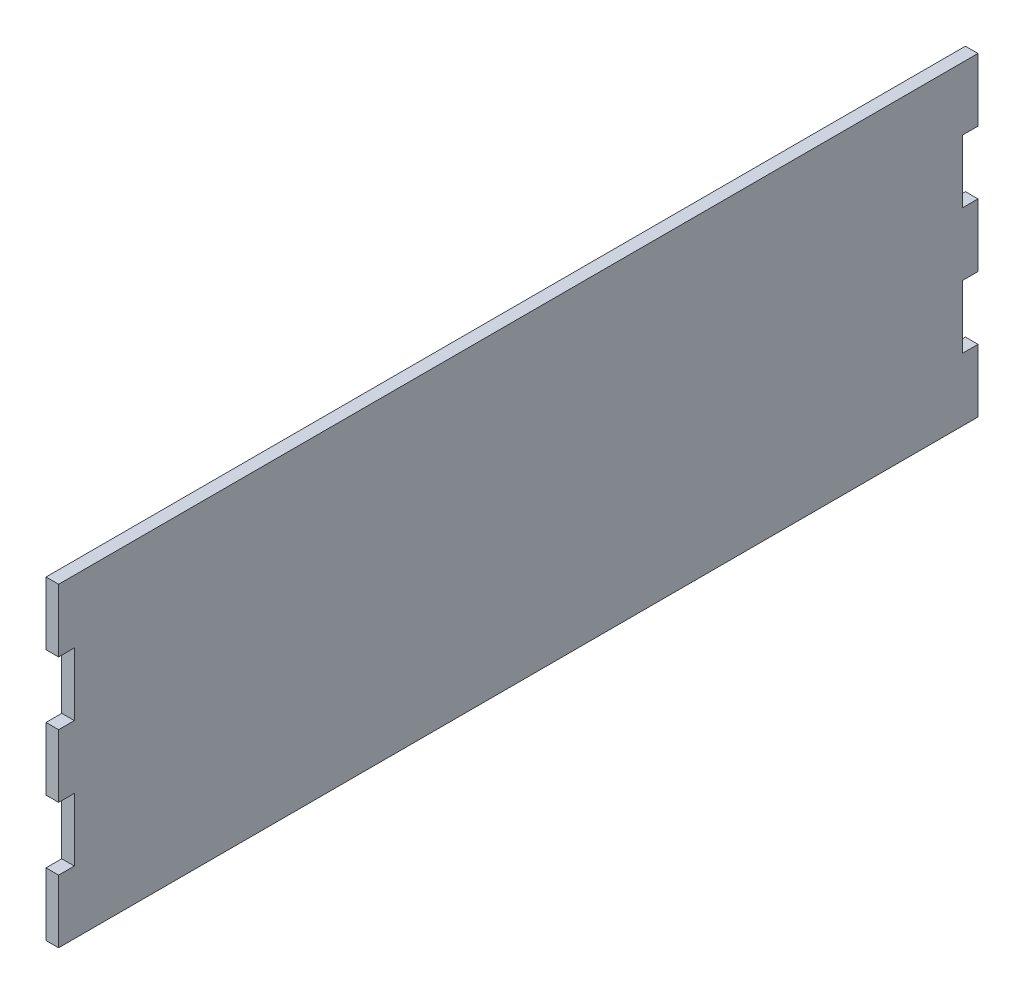
ISO-10303-21;
HEADER;
FILE_DESCRIPTION(('STEP AP214'),'2;1');
FILE_NAME('part.step','',(''),(''),'','','');
FILE_SCHEMA(('AUTOMOTIVE_DESIGN { 1 0 10303 214 1 1 1 1 }'));
ENDSEC;
DATA;
#1=APPLICATION_CONTEXT('core data for automotive mechanical design processes');
#2=APPLICATION_PROTOCOL_DEFINITION('international standard','automotive_design',2000,#1);
#3=PRODUCT_CONTEXT('',#1,'mechanical');
#4=PRODUCT('Part','Part','',(#3));
#5=PRODUCT_RELATED_PRODUCT_CATEGORY('part','',(#4));
#6=PRODUCT_DEFINITION_FORMATION('','',#4);
#7=PRODUCT_DEFINITION_CONTEXT('part definition',#1,'design');
#8=PRODUCT_DEFINITION('design','',#6,#7);
#9=PRODUCT_DEFINITION_SHAPE('','',#8);
#10=(LENGTH_UNIT() NAMED_UNIT(*) SI_UNIT(.MILLI.,.METRE.));
#11=(NAMED_UNIT(*) PLANE_ANGLE_UNIT() SI_UNIT($,.RADIAN.));
#12=(NAMED_UNIT(*) SI_UNIT($,.STERADIAN.) SOLID_ANGLE_UNIT());
#13=UNCERTAINTY_MEASURE_WITH_UNIT(LENGTH_MEASURE(1.E-05),#10,'distance_accuracy_value','');
#14=(GEOMETRIC_REPRESENTATION_CONTEXT(3) GLOBAL_UNCERTAINTY_ASSIGNED_CONTEXT((#13)) GLOBAL_UNIT_ASSIGNED_CONTEXT((#10,
#11,#12)) REPRESENTATION_CONTEXT('',''));
#15=CARTESIAN_POINT('',(0.,0.,0.));
#16=DIRECTION('',(0.,0.,1.));
#17=DIRECTION('',(1.,0.,0.));
#18=AXIS2_PLACEMENT_3D('',#15,#16,#17);
#19=CARTESIAN_POINT('',(4.,-32.0380290037037,-145.));
#20=DIRECTION('',(0.,0.,1.));
#21=DIRECTION('',(0.,-1.,0.));
#22=AXIS2_PLACEMENT_3D('',#19,#20,#21);
#23=PLANE('',#22);
#24=DIRECTION('',(0.,1.,0.));
#25=VECTOR('',#24,1.);
#26=CARTESIAN_POINT('',(0.,-32.0380290037037,-145.));
#27=LINE('',#26,#25);
#28=CARTESIAN_POINT('',(0.,-52.0380290037037,-145.));
#29=VERTEX_POINT('',#28);
#30=CARTESIAN_POINT('',(0.,-32.0380290037037,-145.));
#31=VERTEX_POINT('',#30);
#32=EDGE_CURVE('E205',#29,#31,#27,.T.);
#33=ORIENTED_EDGE('',*,*,#32,.T.);
#34=DIRECTION('',(-1.,0.,0.));
#35=VECTOR('',#34,1.);
#36=CARTESIAN_POINT('',(4.,-32.0380290037037,-145.));
#37=LINE('',#36,#35);
#38=CARTESIAN_POINT('',(4.,-32.0380290037037,-145.));
#39=VERTEX_POINT('',#38);
#40=EDGE_CURVE('E11',#39,#31,#37,.T.);
#41=ORIENTED_EDGE('',*,*,#40,.F.);
#42=DIRECTION('',(0.,1.,0.));
#43=VECTOR('',#42,1.);
#44=CARTESIAN_POINT('',(4.,-32.0380290037037,-145.));
#45=LINE('',#44,#43);
#46=CARTESIAN_POINT('',(4.,-52.0380290037037,-145.));
#47=VERTEX_POINT('',#46);
#48=EDGE_CURVE('E243',#47,#39,#45,.T.);
#49=ORIENTED_EDGE('',*,*,#48,.F.);
#50=DIRECTION('',(-1.,0.,0.));
#51=VECTOR('',#50,1.);
#52=CARTESIAN_POINT('',(4.,-52.0380290037037,-145.));
#53=LINE('',#52,#51);
#54=EDGE_CURVE('E201',#47,#29,#53,.T.);
#55=ORIENTED_EDGE('',*,*,#54,.T.);
#56=EDGE_LOOP('',(#33,#41,#49,#55));
#57=FACE_BOUND('',#56,.T.);
#58=ADVANCED_FACE('F37',(#57),#23,.F.);
#59=CARTESIAN_POINT('',(4.,-32.0380290037037,-145.));
#60=DIRECTION('',(0.,-1.,0.));
#61=DIRECTION('',(0.,0.,-1.));
#62=AXIS2_PLACEMENT_3D('',#59,#60,#61);
#63=PLANE('',#62);
#64=DIRECTION('',(0.,0.,1.));
#65=VECTOR('',#64,1.);
#66=CARTESIAN_POINT('',(0.,-32.0380290037037,-145.));
#67=LINE('',#66,#65);
#68=CARTESIAN_POINT('',(0.,-32.0380290037037,-140.));
#69=VERTEX_POINT('',#68);
#70=EDGE_CURVE('E208',#31,#69,#67,.T.);
#71=ORIENTED_EDGE('',*,*,#70,.T.);
#72=DIRECTION('',(-1.,0.,0.));
#73=VECTOR('',#72,1.);
#74=CARTESIAN_POINT('',(4.,-32.0380290037037,-140.));
#75=LINE('',#74,#73);
#76=CARTESIAN_POINT('',(4.,-32.0380290037037,-140.));
#77=VERTEX_POINT('',#76);
#78=EDGE_CURVE('E45',#77,#69,#75,.T.);
#79=ORIENTED_EDGE('',*,*,#78,.F.);
#80=DIRECTION('',(0.,0.,1.));
#81=VECTOR('',#80,1.);
#82=CARTESIAN_POINT('',(4.,-32.0380290037037,-145.));
#83=LINE('',#82,#81);
#84=EDGE_CURVE('E132',#39,#77,#83,.T.);
#85=ORIENTED_EDGE('',*,*,#84,.F.);
#86=ORIENTED_EDGE('',*,*,#40,.T.);
#87=EDGE_LOOP('',(#71,#79,#85,#86));
#88=FACE_BOUND('',#87,.T.);
#89=ADVANCED_FACE('F361',(#88),#63,.F.);
#90=CARTESIAN_POINT('',(4.,-12.0380290037037,-140.));
#91=DIRECTION('',(0.,0.,1.));
#92=DIRECTION('',(0.,-1.,0.));
#93=AXIS2_PLACEMENT_3D('',#90,#91,#92);
#94=PLANE('',#93);
#95=DIRECTION('',(0.,1.,0.));
#96=VECTOR('',#95,1.);
#97=CARTESIAN_POINT('',(0.,-12.0380290037037,-140.));
#98=LINE('',#97,#96);
#99=CARTESIAN_POINT('',(0.,-12.0380290037037,-140.));
#100=VERTEX_POINT('',#99);
#101=EDGE_CURVE('E210',#69,#100,#98,.T.);
#102=ORIENTED_EDGE('',*,*,#101,.T.);
#103=DIRECTION('',(-1.,0.,0.));
#104=VECTOR('',#103,1.);
#105=CARTESIAN_POINT('',(4.,-12.0380290037037,-140.));
#106=LINE('',#105,#104);
#107=CARTESIAN_POINT('',(4.,-12.0380290037037,-140.));
#108=VERTEX_POINT('',#107);
#109=EDGE_CURVE('E286',#108,#100,#106,.T.);
#110=ORIENTED_EDGE('',*,*,#109,.F.);
#111=DIRECTION('',(0.,1.,0.));
#112=VECTOR('',#111,1.);
#113=CARTESIAN_POINT('',(4.,-12.0380290037037,-140.));
#114=LINE('',#113,#112);
#115=EDGE_CURVE('E294',#77,#108,#114,.T.);
#116=ORIENTED_EDGE('',*,*,#115,.F.);
#117=ORIENTED_EDGE('',*,*,#78,.T.);
#118=EDGE_LOOP('',(#102,#110,#116,#117));
#119=FACE_BOUND('',#118,.T.);
#120=ADVANCED_FACE('F292',(#119),#94,.F.);
#121=CARTESIAN_POINT('',(4.,-12.0380290037037,-145.));
#122=DIRECTION('',(0.,1.,0.));
#123=DIRECTION('',(0.,0.,1.));
#124=AXIS2_PLACEMENT_3D('',#121,#122,#123);
#125=PLANE('',#124);
#126=DIRECTION('',(0.,0.,-1.));
#127=VECTOR('',#126,1.);
#128=CARTESIAN_POINT('',(0.,-12.0380290037037,-145.));
#129=LINE('',#128,#127);
#130=CARTESIAN_POINT('',(0.,-12.0380290037037,-145.));
#131=VERTEX_POINT('',#130);
#132=EDGE_CURVE('E212',#100,#131,#129,.T.);
#133=ORIENTED_EDGE('',*,*,#132,.T.);
#134=DIRECTION('',(-1.,0.,0.));
#135=VECTOR('',#134,1.);
#136=CARTESIAN_POINT('',(4.,-12.0380290037037,-145.));
#137=LINE('',#136,#135);
#138=CARTESIAN_POINT('',(4.,-12.0380290037037,-145.));
#139=VERTEX_POINT('',#138);
#140=EDGE_CURVE('E283',#139,#131,#137,.T.);
#141=ORIENTED_EDGE('',*,*,#140,.F.);
#142=DIRECTION('',(0.,0.,-1.));
#143=VECTOR('',#142,1.);
#144=CARTESIAN_POINT('',(4.,-12.0380290037037,-145.));
#145=LINE('',#144,#143);
#146=EDGE_CURVE('E312',#108,#139,#145,.T.);
#147=ORIENTED_EDGE('',*,*,#146,.F.);
#148=ORIENTED_EDGE('',*,*,#109,.T.);
#149=EDGE_LOOP('',(#133,#141,#147,#148));
#150=FACE_BOUND('',#149,.T.);
#151=ADVANCED_FACE('F303',(#150),#125,.F.);
#152=CARTESIAN_POINT('',(4.,7.96197099629627,-145.));
#153=DIRECTION('',(0.,0.,1.));
#154=DIRECTION('',(0.,-1.,0.));
#155=AXIS2_PLACEMENT_3D('',#152,#153,#154);
#156=PLANE('',#155);
#157=DIRECTION('',(0.,1.,0.));
#158=VECTOR('',#157,1.);
#159=CARTESIAN_POINT('',(0.,7.96197099629627,-145.));
#160=LINE('',#159,#158);
#161=CARTESIAN_POINT('',(0.,7.96197099629627,-145.));
#162=VERTEX_POINT('',#161);
#163=EDGE_CURVE('E214',#131,#162,#160,.T.);
#164=ORIENTED_EDGE('',*,*,#163,.T.);
#165=DIRECTION('',(-1.,0.,0.));
#166=VECTOR('',#165,1.);
#167=CARTESIAN_POINT('',(4.,7.96197099629627,-145.));
#168=LINE('',#167,#166);
#169=CARTESIAN_POINT('',(4.,7.96197099629627,-145.));
#170=VERTEX_POINT('',#169);
#171=EDGE_CURVE('E280',#170,#162,#168,.T.);
#172=ORIENTED_EDGE('',*,*,#171,.F.);
#173=DIRECTION('',(0.,1.,0.));
#174=VECTOR('',#173,1.);
#175=CARTESIAN_POINT('',(4.,7.96197099629627,-145.));
#176=LINE('',#175,#174);
#177=EDGE_CURVE('E309',#139,#170,#176,.T.);
#178=ORIENTED_EDGE('',*,*,#177,.F.);
#179=ORIENTED_EDGE('',*,*,#140,.T.);
#180=EDGE_LOOP('',(#164,#172,#178,#179));
#181=FACE_BOUND('',#180,.T.);
#182=ADVANCED_FACE('F307',(#181),#156,.F.);
#183=CARTESIAN_POINT('',(4.,7.96197099629627,-145.));
#184=DIRECTION('',(0.,-1.,0.));
#185=DIRECTION('',(0.,0.,-1.));
#186=AXIS2_PLACEMENT_3D('',#183,#184,#185);
#187=PLANE('',#186);
#188=DIRECTION('',(0.,0.,1.));
#189=VECTOR('',#188,1.);
#190=CARTESIAN_POINT('',(0.,7.96197099629627,-145.));
#191=LINE('',#190,#189);
#192=CARTESIAN_POINT('',(0.,7.96197099629627,-140.));
#193=VERTEX_POINT('',#192);
#194=EDGE_CURVE('E216',#162,#193,#191,.T.);
#195=ORIENTED_EDGE('',*,*,#194,.T.);
#196=DIRECTION('',(-1.,0.,0.));
#197=VECTOR('',#196,1.);
#198=CARTESIAN_POINT('',(4.,7.96197099629627,-140.));
#199=LINE('',#198,#197);
#200=CARTESIAN_POINT('',(4.,7.96197099629627,-140.));
#201=VERTEX_POINT('',#200);
#202=EDGE_CURVE('E277',#201,#193,#199,.T.);
#203=ORIENTED_EDGE('',*,*,#202,.F.);
#204=DIRECTION('',(0.,0.,1.));
#205=VECTOR('',#204,1.);
#206=CARTESIAN_POINT('',(4.,7.96197099629627,-145.));
#207=LINE('',#206,#205);
#208=EDGE_CURVE('E311',#170,#201,#207,.T.);
#209=ORIENTED_EDGE('',*,*,#208,.F.);
#210=ORIENTED_EDGE('',*,*,#171,.T.);
#211=EDGE_LOOP('',(#195,#203,#209,#210));
#212=FACE_BOUND('',#211,.T.);
#213=ADVANCED_FACE('F374',(#212),#187,.F.);
#214=CARTESIAN_POINT('',(4.,27.9619709962963,-140.));
#215=DIRECTION('',(0.,0.,1.));
#216=DIRECTION('',(0.,-1.,0.));
#217=AXIS2_PLACEMENT_3D('',#214,#215,#216);
#218=PLANE('',#217);
#219=DIRECTION('',(0.,1.,0.));
#220=VECTOR('',#219,1.);
#221=CARTESIAN_POINT('',(0.,27.9619709962963,-140.));
#222=LINE('',#221,#220);
#223=CARTESIAN_POINT('',(0.,27.9619709962963,-140.));
#224=VERTEX_POINT('',#223);
#225=EDGE_CURVE('E218',#193,#224,#222,.T.);
#226=ORIENTED_EDGE('',*,*,#225,.T.);
#227=DIRECTION('',(-1.,0.,0.));
#228=VECTOR('',#227,1.);
#229=CARTESIAN_POINT('',(4.,27.9619709962963,-140.));
#230=LINE('',#229,#228);
#231=CARTESIAN_POINT('',(4.,27.9619709962963,-140.));
#232=VERTEX_POINT('',#231);
#233=EDGE_CURVE('E274',#232,#224,#230,.T.);
#234=ORIENTED_EDGE('',*,*,#233,.F.);
#235=DIRECTION('',(0.,1.,0.));
#236=VECTOR('',#235,1.);
#237=CARTESIAN_POINT('',(4.,27.9619709962963,-140.));
#238=LINE('',#237,#236);
#239=EDGE_CURVE('E314',#201,#232,#238,.T.);
#240=ORIENTED_EDGE('',*,*,#239,.F.);
#241=ORIENTED_EDGE('',*,*,#202,.T.);
#242=EDGE_LOOP('',(#226,#234,#240,#241));
#243=FACE_BOUND('',#242,.T.);
#244=ADVANCED_FACE('F377',(#243),#218,.F.);
#245=CARTESIAN_POINT('',(4.,27.9619709962963,-145.));
#246=DIRECTION('',(0.,1.,0.));
#247=DIRECTION('',(0.,0.,1.));
#248=AXIS2_PLACEMENT_3D('',#245,#246,#247);
#249=PLANE('',#248);
#250=DIRECTION('',(0.,0.,-1.));
#251=VECTOR('',#250,1.);
#252=CARTESIAN_POINT('',(0.,27.9619709962963,-145.));
#253=LINE('',#252,#251);
#254=CARTESIAN_POINT('',(0.,27.9619709962963,-145.));
#255=VERTEX_POINT('',#254);
#256=EDGE_CURVE('E220',#224,#255,#253,.T.);
#257=ORIENTED_EDGE('',*,*,#256,.T.);
#258=DIRECTION('',(-1.,0.,0.));
#259=VECTOR('',#258,1.);
#260=CARTESIAN_POINT('',(4.,27.9619709962963,-145.));
#261=LINE('',#260,#259);
#262=CARTESIAN_POINT('',(4.,27.9619709962963,-145.));
#263=VERTEX_POINT('',#262);
#264=EDGE_CURVE('E271',#263,#255,#261,.T.);
#265=ORIENTED_EDGE('',*,*,#264,.F.);
#266=DIRECTION('',(0.,0.,-1.));
#267=VECTOR('',#266,1.);
#268=CARTESIAN_POINT('',(4.,27.9619709962963,-145.));
#269=LINE('',#268,#267);
#270=EDGE_CURVE('E320',#232,#263,#269,.T.);
#271=ORIENTED_EDGE('',*,*,#270,.F.);
#272=ORIENTED_EDGE('',*,*,#233,.T.);
#273=EDGE_LOOP('',(#257,#265,#271,#272));
#274=FACE_BOUND('',#273,.T.);
#275=ADVANCED_FACE('F381',(#274),#249,.F.);
#276=CARTESIAN_POINT('',(4.,47.9619709962962,-145.));
#277=DIRECTION('',(0.,0.,1.));
#278=DIRECTION('',(1.,0.,0.));
#279=AXIS2_PLACEMENT_3D('',#276,#277,#278);
#280=PLANE('',#279);
#281=DIRECTION('',(0.,1.,0.));
#282=VECTOR('',#281,1.);
#283=CARTESIAN_POINT('',(0.,47.9619709962962,-145.));
#284=LINE('',#283,#282);
#285=CARTESIAN_POINT('',(0.,47.9619709962962,-145.));
#286=VERTEX_POINT('',#285);
#287=EDGE_CURVE('E222',#255,#286,#284,.T.);
#288=ORIENTED_EDGE('',*,*,#287,.T.);
#289=DIRECTION('',(-1.,0.,0.));
#290=VECTOR('',#289,1.);
#291=CARTESIAN_POINT('',(4.,47.9619709962962,-145.));
#292=LINE('',#291,#290);
#293=CARTESIAN_POINT('',(4.,47.9619709962962,-145.));
#294=VERTEX_POINT('',#293);
#295=EDGE_CURVE('E268',#294,#286,#292,.T.);
#296=ORIENTED_EDGE('',*,*,#295,.F.);
#297=DIRECTION('',(0.,1.,0.));
#298=VECTOR('',#297,1.);
#299=CARTESIAN_POINT('',(4.,47.9619709962962,-145.));
#300=LINE('',#299,#298);
#301=EDGE_CURVE('E322',#263,#294,#300,.T.);
#302=ORIENTED_EDGE('',*,*,#301,.F.);
#303=ORIENTED_EDGE('',*,*,#264,.T.);
#304=EDGE_LOOP('',(#288,#296,#302,#303));
#305=FACE_BOUND('',#304,.T.);
#306=ADVANCED_FACE('F385',(#305),#280,.F.);
#307=CARTESIAN_POINT('',(4.,47.9619709962962,147.));
#308=DIRECTION('',(0.,-1.,0.));
#309=DIRECTION('',(0.,0.,-1.));
#310=AXIS2_PLACEMENT_3D('',#307,#308,#309);
#311=PLANE('',#310);
#312=DIRECTION('',(0.,0.,1.));
#313=VECTOR('',#312,1.);
#314=CARTESIAN_POINT('',(0.,47.9619709962962,147.));
#315=LINE('',#314,#313);
#316=CARTESIAN_POINT('',(0.,47.9619709962962,147.));
#317=VERTEX_POINT('',#316);
#318=EDGE_CURVE('E224',#286,#317,#315,.T.);
#319=ORIENTED_EDGE('',*,*,#318,.T.);
#320=DIRECTION('',(-1.,0.,0.));
#321=VECTOR('',#320,1.);
#322=CARTESIAN_POINT('',(4.,47.9619709962962,147.));
#323=LINE('',#322,#321);
#324=CARTESIAN_POINT('',(4.,47.9619709962962,147.));
#325=VERTEX_POINT('',#324);
#326=EDGE_CURVE('E265',#325,#317,#323,.T.);
#327=ORIENTED_EDGE('',*,*,#326,.F.);
#328=DIRECTION('',(0.,0.,1.));
#329=VECTOR('',#328,1.);
#330=CARTESIAN_POINT('',(4.,47.9619709962962,147.));
#331=LINE('',#330,#329);
#332=EDGE_CURVE('E324',#294,#325,#331,.T.);
#333=ORIENTED_EDGE('',*,*,#332,.F.);
#334=ORIENTED_EDGE('',*,*,#295,.T.);
#335=EDGE_LOOP('',(#319,#327,#333,#334));
#336=FACE_BOUND('',#335,.T.);
#337=ADVANCED_FACE('F389',(#336),#311,.F.);
#338=CARTESIAN_POINT('',(4.,47.9619709962962,147.));
#339=DIRECTION('',(0.,0.,-1.));
#340=DIRECTION('',(-1.,0.,0.));
#341=AXIS2_PLACEMENT_3D('',#338,#339,#340);
#342=PLANE('',#341);
#343=DIRECTION('',(0.,-1.,0.));
#344=VECTOR('',#343,1.);
#345=CARTESIAN_POINT('',(0.,47.9619709962962,147.));
#346=LINE('',#345,#344);
#347=CARTESIAN_POINT('',(0.,27.9619709962962,147.));
#348=VERTEX_POINT('',#347);
#349=EDGE_CURVE('E226',#317,#348,#346,.T.);
#350=ORIENTED_EDGE('',*,*,#349,.T.);
#351=DIRECTION('',(-1.,0.,0.));
#352=VECTOR('',#351,1.);
#353=CARTESIAN_POINT('',(4.,27.9619709962962,147.));
#354=LINE('',#353,#352);
#355=CARTESIAN_POINT('',(4.,27.9619709962962,147.));
#356=VERTEX_POINT('',#355);
#357=EDGE_CURVE('E262',#356,#348,#354,.T.);
#358=ORIENTED_EDGE('',*,*,#357,.F.);
#359=DIRECTION('',(0.,-1.,0.));
#360=VECTOR('',#359,1.);
#361=CARTESIAN_POINT('',(4.,47.9619709962962,147.));
#362=LINE('',#361,#360);
#363=EDGE_CURVE('E326',#325,#356,#362,.T.);
#364=ORIENTED_EDGE('',*,*,#363,.F.);
#365=ORIENTED_EDGE('',*,*,#326,.T.);
#366=EDGE_LOOP('',(#350,#358,#364,#365));
#367=FACE_BOUND('',#366,.T.);
#368=ADVANCED_FACE('F393',(#367),#342,.F.);
#369=CARTESIAN_POINT('',(4.,27.9619709962962,147.));
#370=DIRECTION('',(0.,1.,0.));
#371=DIRECTION('',(0.,0.,1.));
#372=AXIS2_PLACEMENT_3D('',#369,#370,#371);
#373=PLANE('',#372);
#374=DIRECTION('',(0.,0.,-1.));
#375=VECTOR('',#374,1.);
#376=CARTESIAN_POINT('',(0.,27.9619709962962,147.));
#377=LINE('',#376,#375);
#378=CARTESIAN_POINT('',(0.,27.9619709962962,142.));
#379=VERTEX_POINT('',#378);
#380=EDGE_CURVE('E228',#348,#379,#377,.T.);
#381=ORIENTED_EDGE('',*,*,#380,.T.);
#382=DIRECTION('',(-1.,0.,0.));
#383=VECTOR('',#382,1.);
#384=CARTESIAN_POINT('',(4.,27.9619709962962,142.));
#385=LINE('',#384,#383);
#386=CARTESIAN_POINT('',(4.,27.9619709962962,142.));
#387=VERTEX_POINT('',#386);
#388=EDGE_CURVE('E259',#387,#379,#385,.T.);
#389=ORIENTED_EDGE('',*,*,#388,.F.);
#390=DIRECTION('',(0.,0.,-1.));
#391=VECTOR('',#390,1.);
#392=CARTESIAN_POINT('',(4.,27.9619709962962,147.));
#393=LINE('',#392,#391);
#394=EDGE_CURVE('E328',#356,#387,#393,.T.);
#395=ORIENTED_EDGE('',*,*,#394,.F.);
#396=ORIENTED_EDGE('',*,*,#357,.T.);
#397=EDGE_LOOP('',(#381,#389,#395,#396));
#398=FACE_BOUND('',#397,.T.);
#399=ADVANCED_FACE('F397',(#398),#373,.F.);
#400=CARTESIAN_POINT('',(4.,27.9619709962962,142.));
#401=DIRECTION('',(0.,0.,-1.));
#402=DIRECTION('',(0.,1.,0.));
#403=AXIS2_PLACEMENT_3D('',#400,#401,#402);
#404=PLANE('',#403);
#405=DIRECTION('',(0.,-1.,0.));
#406=VECTOR('',#405,1.);
#407=CARTESIAN_POINT('',(0.,27.9619709962962,142.));
#408=LINE('',#407,#406);
#409=CARTESIAN_POINT('',(0.,7.96197099629625,142.));
#410=VERTEX_POINT('',#409);
#411=EDGE_CURVE('E230',#379,#410,#408,.T.);
#412=ORIENTED_EDGE('',*,*,#411,.T.);
#413=DIRECTION('',(-1.,0.,0.));
#414=VECTOR('',#413,1.);
#415=CARTESIAN_POINT('',(4.,7.96197099629625,142.));
#416=LINE('',#415,#414);
#417=CARTESIAN_POINT('',(4.,7.96197099629625,142.));
#418=VERTEX_POINT('',#417);
#419=EDGE_CURVE('E256',#418,#410,#416,.T.);
#420=ORIENTED_EDGE('',*,*,#419,.F.);
#421=DIRECTION('',(0.,-1.,0.));
#422=VECTOR('',#421,1.);
#423=CARTESIAN_POINT('',(4.,27.9619709962962,142.));
#424=LINE('',#423,#422);
#425=EDGE_CURVE('E330',#387,#418,#424,.T.);
#426=ORIENTED_EDGE('',*,*,#425,.F.);
#427=ORIENTED_EDGE('',*,*,#388,.T.);
#428=EDGE_LOOP('',(#412,#420,#426,#427));
#429=FACE_BOUND('',#428,.T.);
#430=ADVANCED_FACE('F401',(#429),#404,.F.);
#431=CARTESIAN_POINT('',(4.,7.96197099629625,147.));
#432=DIRECTION('',(0.,-1.,0.));
#433=DIRECTION('',(0.,0.,-1.));
#434=AXIS2_PLACEMENT_3D('',#431,#432,#433);
#435=PLANE('',#434);
#436=DIRECTION('',(0.,0.,1.));
#437=VECTOR('',#436,1.);
#438=CARTESIAN_POINT('',(0.,7.96197099629625,147.));
#439=LINE('',#438,#437);
#440=CARTESIAN_POINT('',(0.,7.96197099629625,147.));
#441=VERTEX_POINT('',#440);
#442=EDGE_CURVE('E232',#410,#441,#439,.T.);
#443=ORIENTED_EDGE('',*,*,#442,.T.);
#444=DIRECTION('',(-1.,0.,0.));
#445=VECTOR('',#444,1.);
#446=CARTESIAN_POINT('',(4.,7.96197099629625,147.));
#447=LINE('',#446,#445);
#448=CARTESIAN_POINT('',(4.,7.96197099629625,147.));
#449=VERTEX_POINT('',#448);
#450=EDGE_CURVE('E253',#449,#441,#447,.T.);
#451=ORIENTED_EDGE('',*,*,#450,.F.);
#452=DIRECTION('',(0.,0.,1.));
#453=VECTOR('',#452,1.);
#454=CARTESIAN_POINT('',(4.,7.96197099629625,147.));
#455=LINE('',#454,#453);
#456=EDGE_CURVE('E332',#418,#449,#455,.T.);
#457=ORIENTED_EDGE('',*,*,#456,.F.);
#458=ORIENTED_EDGE('',*,*,#419,.T.);
#459=EDGE_LOOP('',(#443,#451,#457,#458));
#460=FACE_BOUND('',#459,.T.);
#461=ADVANCED_FACE('F405',(#460),#435,.F.);
#462=CARTESIAN_POINT('',(4.,7.96197099629625,147.));
#463=DIRECTION('',(0.,0.,-1.));
#464=DIRECTION('',(0.,1.,0.));
#465=AXIS2_PLACEMENT_3D('',#462,#463,#464);
#466=PLANE('',#465);
#467=DIRECTION('',(0.,-1.,0.));
#468=VECTOR('',#467,1.);
#469=CARTESIAN_POINT('',(0.,7.96197099629625,147.));
#470=LINE('',#469,#468);
#471=CARTESIAN_POINT('',(0.,-12.0380290037038,147.));
#472=VERTEX_POINT('',#471);
#473=EDGE_CURVE('E234',#441,#472,#470,.T.);
#474=ORIENTED_EDGE('',*,*,#473,.T.);
#475=DIRECTION('',(-1.,0.,0.));
#476=VECTOR('',#475,1.);
#477=CARTESIAN_POINT('',(4.,-12.0380290037038,147.));
#478=LINE('',#477,#476);
#479=CARTESIAN_POINT('',(4.,-12.0380290037038,147.));
#480=VERTEX_POINT('',#479);
#481=EDGE_CURVE('E250',#480,#472,#478,.T.);
#482=ORIENTED_EDGE('',*,*,#481,.F.);
#483=DIRECTION('',(0.,-1.,0.));
#484=VECTOR('',#483,1.);
#485=CARTESIAN_POINT('',(4.,7.96197099629625,147.));
#486=LINE('',#485,#484);
#487=EDGE_CURVE('E334',#449,#480,#486,.T.);
#488=ORIENTED_EDGE('',*,*,#487,.F.);
#489=ORIENTED_EDGE('',*,*,#450,.T.);
#490=EDGE_LOOP('',(#474,#482,#488,#489));
#491=FACE_BOUND('',#490,.T.);
#492=ADVANCED_FACE('F409',(#491),#466,.F.);
#493=CARTESIAN_POINT('',(4.,-12.0380290037038,147.));
#494=DIRECTION('',(0.,1.,0.));
#495=DIRECTION('',(0.,0.,1.));
#496=AXIS2_PLACEMENT_3D('',#493,#494,#495);
#497=PLANE('',#496);
#498=DIRECTION('',(0.,0.,-1.));
#499=VECTOR('',#498,1.);
#500=CARTESIAN_POINT('',(0.,-12.0380290037038,147.));
#501=LINE('',#500,#499);
#502=CARTESIAN_POINT('',(0.,-12.0380290037038,142.));
#503=VERTEX_POINT('',#502);
#504=EDGE_CURVE('E236',#472,#503,#501,.T.);
#505=ORIENTED_EDGE('',*,*,#504,.T.);
#506=DIRECTION('',(-1.,0.,0.));
#507=VECTOR('',#506,1.);
#508=CARTESIAN_POINT('',(4.,-12.0380290037038,142.));
#509=LINE('',#508,#507);
#510=CARTESIAN_POINT('',(4.,-12.0380290037038,142.));
#511=VERTEX_POINT('',#510);
#512=EDGE_CURVE('E247',#511,#503,#509,.T.);
#513=ORIENTED_EDGE('',*,*,#512,.F.);
#514=DIRECTION('',(0.,0.,-1.));
#515=VECTOR('',#514,1.);
#516=CARTESIAN_POINT('',(4.,-12.0380290037038,147.));
#517=LINE('',#516,#515);
#518=EDGE_CURVE('E336',#480,#511,#517,.T.);
#519=ORIENTED_EDGE('',*,*,#518,.F.);
#520=ORIENTED_EDGE('',*,*,#481,.T.);
#521=EDGE_LOOP('',(#505,#513,#519,#520));
#522=FACE_BOUND('',#521,.T.);
#523=ADVANCED_FACE('F342',(#522),#497,.F.);
#524=CARTESIAN_POINT('',(4.,-12.0380290037038,142.));
#525=DIRECTION('',(0.,0.,-1.));
#526=DIRECTION('',(0.,1.,0.));
#527=AXIS2_PLACEMENT_3D('',#524,#525,#526);
#528=PLANE('',#527);
#529=DIRECTION('',(0.,-1.,0.));
#530=VECTOR('',#529,1.);
#531=CARTESIAN_POINT('',(0.,-12.0380290037038,142.));
#532=LINE('',#531,#530);
#533=CARTESIAN_POINT('',(0.,-32.0380290037038,141.999999999999));
#534=VERTEX_POINT('',#533);
#535=EDGE_CURVE('E238',#503,#534,#532,.T.);
#536=ORIENTED_EDGE('',*,*,#535,.T.);
#537=DIRECTION('',(-1.,0.,0.));
#538=VECTOR('',#537,1.);
#539=CARTESIAN_POINT('',(4.,-32.0380290037038,141.999999999999));
#540=LINE('',#539,#538);
#541=CARTESIAN_POINT('',(4.,-32.0380290037038,141.999999999999));
#542=VERTEX_POINT('',#541);
#543=EDGE_CURVE('E196',#542,#534,#540,.T.);
#544=ORIENTED_EDGE('',*,*,#543,.F.);
#545=DIRECTION('',(0.,-1.,0.));
#546=VECTOR('',#545,1.);
#547=CARTESIAN_POINT('',(4.,-12.0380290037038,142.));
#548=LINE('',#547,#546);
#549=EDGE_CURVE('E187',#511,#542,#548,.T.);
#550=ORIENTED_EDGE('',*,*,#549,.F.);
#551=ORIENTED_EDGE('',*,*,#512,.T.);
#552=EDGE_LOOP('',(#536,#544,#550,#551));
#553=FACE_BOUND('',#552,.T.);
#554=ADVANCED_FACE('F346',(#553),#528,.F.);
#555=CARTESIAN_POINT('',(4.,-32.0380290037038,146.999999999999));
#556=DIRECTION('',(0.,-1.,0.));
#557=DIRECTION('',(0.,0.,-1.));
#558=AXIS2_PLACEMENT_3D('',#555,#556,#557);
#559=PLANE('',#558);
#560=DIRECTION('',(0.,0.,1.));
#561=VECTOR('',#560,1.);
#562=CARTESIAN_POINT('',(0.,-32.0380290037038,146.999999999999));
#563=LINE('',#562,#561);
#564=CARTESIAN_POINT('',(0.,-32.0380290037038,146.999999999999));
#565=VERTEX_POINT('',#564);
#566=EDGE_CURVE('E195',#534,#565,#563,.T.);
#567=ORIENTED_EDGE('',*,*,#566,.T.);
#568=DIRECTION('',(-1.,0.,0.));
#569=VECTOR('',#568,1.);
#570=CARTESIAN_POINT('',(4.,-32.0380290037038,146.999999999999));
#571=LINE('',#570,#569);
#572=CARTESIAN_POINT('',(4.,-32.0380290037038,146.999999999999));
#573=VERTEX_POINT('',#572);
#574=EDGE_CURVE('E192',#573,#565,#571,.T.);
#575=ORIENTED_EDGE('',*,*,#574,.F.);
#576=DIRECTION('',(0.,0.,1.));
#577=VECTOR('',#576,1.);
#578=CARTESIAN_POINT('',(4.,-32.0380290037038,146.999999999999));
#579=LINE('',#578,#577);
#580=EDGE_CURVE('E181',#542,#573,#579,.T.);
#581=ORIENTED_EDGE('',*,*,#580,.F.);
#582=ORIENTED_EDGE('',*,*,#543,.T.);
#583=EDGE_LOOP('',(#567,#575,#581,#582));
#584=FACE_BOUND('',#583,.T.);
#585=ADVANCED_FACE('F193',(#584),#559,.F.);
#586=CARTESIAN_POINT('',(4.,-32.0380290037038,146.999999999999));
#587=DIRECTION('',(0.,0.,-1.));
#588=DIRECTION('',(0.,1.,0.));
#589=AXIS2_PLACEMENT_3D('',#586,#587,#588);
#590=PLANE('',#589);
#591=DIRECTION('',(0.,-1.,0.));
#592=VECTOR('',#591,1.);
#593=CARTESIAN_POINT('',(0.,-32.0380290037038,146.999999999999));
#594=LINE('',#593,#592);
#595=CARTESIAN_POINT('',(0.,-52.0380290037038,146.999999999999));
#596=VERTEX_POINT('',#595);
#597=EDGE_CURVE('E118',#565,#596,#594,.T.);
#598=ORIENTED_EDGE('',*,*,#597,.T.);
#599=DIRECTION('',(-1.,0.,0.));
#600=VECTOR('',#599,1.);
#601=CARTESIAN_POINT('',(4.,-52.0380290037038,146.999999999999));
#602=LINE('',#601,#600);
#603=CARTESIAN_POINT('',(4.,-52.0380290037038,146.999999999999));
#604=VERTEX_POINT('',#603);
#605=EDGE_CURVE('E197',#604,#596,#602,.T.);
#606=ORIENTED_EDGE('',*,*,#605,.F.);
#607=DIRECTION('',(0.,-1.,0.));
#608=VECTOR('',#607,1.);
#609=CARTESIAN_POINT('',(4.,-32.0380290037038,146.999999999999));
#610=LINE('',#609,#608);
#611=EDGE_CURVE('E185',#573,#604,#610,.T.);
#612=ORIENTED_EDGE('',*,*,#611,.F.);
#613=ORIENTED_EDGE('',*,*,#574,.T.);
#614=EDGE_LOOP('',(#598,#606,#612,#613));
#615=FACE_BOUND('',#614,.T.);
#616=ADVANCED_FACE('F199',(#615),#590,.F.);
#617=CARTESIAN_POINT('',(4.,-52.0380290037038,146.999999999999));
#618=DIRECTION('',(0.,1.,0.));
#619=DIRECTION('',(0.,0.,1.));
#620=AXIS2_PLACEMENT_3D('',#617,#618,#619);
#621=PLANE('',#620);
#622=DIRECTION('',(0.,0.,-1.));
#623=VECTOR('',#622,1.);
#624=CARTESIAN_POINT('',(0.,-52.0380290037038,146.999999999999));
#625=LINE('',#624,#623);
#626=EDGE_CURVE('E124',#596,#29,#625,.T.);
#627=ORIENTED_EDGE('',*,*,#626,.T.);
#628=ORIENTED_EDGE('',*,*,#54,.F.);
#629=DIRECTION('',(0.,0.,-1.));
#630=VECTOR('',#629,1.);
#631=CARTESIAN_POINT('',(4.,-52.0380290037038,146.999999999999));
#632=LINE('',#631,#630);
#633=EDGE_CURVE('E53',#604,#47,#632,.T.);
#634=ORIENTED_EDGE('',*,*,#633,.F.);
#635=ORIENTED_EDGE('',*,*,#605,.T.);
#636=EDGE_LOOP('',(#627,#628,#634,#635));
#637=FACE_BOUND('',#636,.T.);
#638=ADVANCED_FACE('F350',(#637),#621,.F.);
#639=CARTESIAN_POINT('',(4.,0.,0.));
#640=DIRECTION('',(1.,0.,0.));
#641=DIRECTION('',(0.,0.,-1.));
#642=AXIS2_PLACEMENT_3D('',#639,#640,#641);
#643=PLANE('',#642);
#644=ORIENTED_EDGE('',*,*,#48,.T.);
#645=ORIENTED_EDGE('',*,*,#84,.T.);
#646=ORIENTED_EDGE('',*,*,#115,.T.);
#647=ORIENTED_EDGE('',*,*,#146,.T.);
#648=ORIENTED_EDGE('',*,*,#177,.T.);
#649=ORIENTED_EDGE('',*,*,#208,.T.);
#650=ORIENTED_EDGE('',*,*,#239,.T.);
#651=ORIENTED_EDGE('',*,*,#270,.T.);
#652=ORIENTED_EDGE('',*,*,#301,.T.);
#653=ORIENTED_EDGE('',*,*,#332,.T.);
#654=ORIENTED_EDGE('',*,*,#363,.T.);
#655=ORIENTED_EDGE('',*,*,#394,.T.);
#656=ORIENTED_EDGE('',*,*,#425,.T.);
#657=ORIENTED_EDGE('',*,*,#456,.T.);
#658=ORIENTED_EDGE('',*,*,#487,.T.);
#659=ORIENTED_EDGE('',*,*,#518,.T.);
#660=ORIENTED_EDGE('',*,*,#549,.T.);
#661=ORIENTED_EDGE('',*,*,#580,.T.);
#662=ORIENTED_EDGE('',*,*,#611,.T.);
#663=ORIENTED_EDGE('',*,*,#633,.T.);
#664=EDGE_LOOP('',(#644,#645,#646,#647,#648,#649,#650,#651,#652,#653,#654,#655,#656,#657,#658,
#659,#660,#661,#662,#663));
#665=FACE_BOUND('',#664,.T.);
#666=ADVANCED_FACE('F183',(#665),#643,.T.);
#667=CARTESIAN_POINT('',(0.,0.,0.));
#668=DIRECTION('',(1.,0.,0.));
#669=DIRECTION('',(0.,0.,-1.));
#670=AXIS2_PLACEMENT_3D('',#667,#668,#669);
#671=PLANE('',#670);
#672=ORIENTED_EDGE('',*,*,#32,.F.);
#673=ORIENTED_EDGE('',*,*,#626,.F.);
#674=ORIENTED_EDGE('',*,*,#597,.F.);
#675=ORIENTED_EDGE('',*,*,#566,.F.);
#676=ORIENTED_EDGE('',*,*,#535,.F.);
#677=ORIENTED_EDGE('',*,*,#504,.F.);
#678=ORIENTED_EDGE('',*,*,#473,.F.);
#679=ORIENTED_EDGE('',*,*,#442,.F.);
#680=ORIENTED_EDGE('',*,*,#411,.F.);
#681=ORIENTED_EDGE('',*,*,#380,.F.);
#682=ORIENTED_EDGE('',*,*,#349,.F.);
#683=ORIENTED_EDGE('',*,*,#318,.F.);
#684=ORIENTED_EDGE('',*,*,#287,.F.);
#685=ORIENTED_EDGE('',*,*,#256,.F.);
#686=ORIENTED_EDGE('',*,*,#225,.F.);
#687=ORIENTED_EDGE('',*,*,#194,.F.);
#688=ORIENTED_EDGE('',*,*,#163,.F.);
#689=ORIENTED_EDGE('',*,*,#132,.F.);
#690=ORIENTED_EDGE('',*,*,#101,.F.);
#691=ORIENTED_EDGE('',*,*,#70,.F.);
#692=EDGE_LOOP('',(#672,#673,#674,#675,#676,#677,#678,#679,#680,#681,#682,#683,#684,#685,#686,
#687,#688,#689,#690,#691));
#693=FACE_BOUND('',#692,.T.);
#694=ADVANCED_FACE('F298',(#693),#671,.F.);
#695=CLOSED_SHELL('',(#58,#89,#120,#151,#182,#213,#244,#275,#306,#337,#368,#399,#430,#461,#492,
#523,#554,#585,#616,#638,#666,#694));
#696=MANIFOLD_SOLID_BREP('B2',#695);
#697=ADVANCED_BREP_SHAPE_REPRESENTATION('',(#18,#696),#14);
#698=SHAPE_DEFINITION_REPRESENTATION(#9,#697);
ENDSEC;
END-ISO-10303-21;
